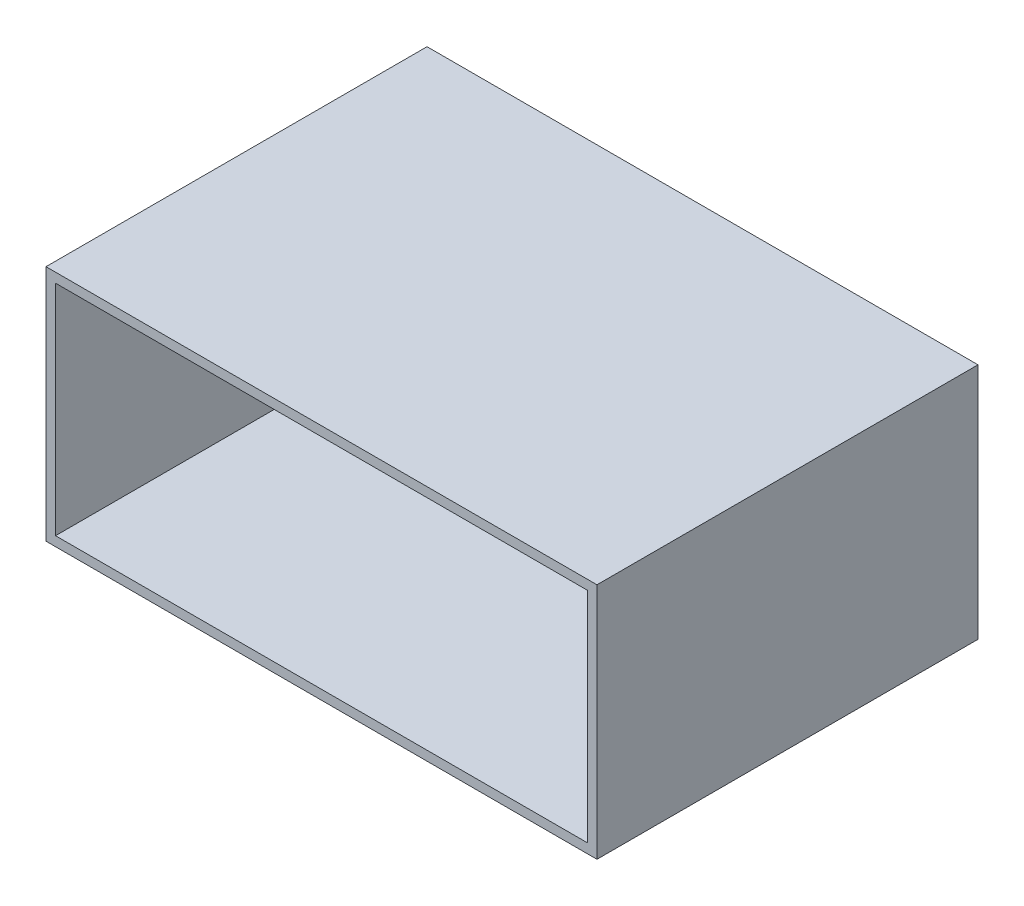
ISO-10303-21;
HEADER;
FILE_DESCRIPTION(('STEP AP214'),'2;1');
FILE_NAME('part.step','',(''),(''),'','','');
FILE_SCHEMA(('AUTOMOTIVE_DESIGN { 1 0 10303 214 1 1 1 1 }'));
ENDSEC;
DATA;
#1=APPLICATION_CONTEXT('core data for automotive mechanical design processes');
#2=APPLICATION_PROTOCOL_DEFINITION('international standard','automotive_design',2000,#1);
#3=PRODUCT_CONTEXT('',#1,'mechanical');
#4=PRODUCT('Part','Part','',(#3));
#5=PRODUCT_RELATED_PRODUCT_CATEGORY('part','',(#4));
#6=PRODUCT_DEFINITION_FORMATION('','',#4);
#7=PRODUCT_DEFINITION_CONTEXT('part definition',#1,'design');
#8=PRODUCT_DEFINITION('design','',#6,#7);
#9=PRODUCT_DEFINITION_SHAPE('','',#8);
#10=(LENGTH_UNIT() NAMED_UNIT(*) SI_UNIT(.MILLI.,.METRE.));
#11=(NAMED_UNIT(*) PLANE_ANGLE_UNIT() SI_UNIT($,.RADIAN.));
#12=(NAMED_UNIT(*) SI_UNIT($,.STERADIAN.) SOLID_ANGLE_UNIT());
#13=UNCERTAINTY_MEASURE_WITH_UNIT(LENGTH_MEASURE(1.E-05),#10,'distance_accuracy_value','');
#14=(GEOMETRIC_REPRESENTATION_CONTEXT(3) GLOBAL_UNCERTAINTY_ASSIGNED_CONTEXT((#13)) GLOBAL_UNIT_ASSIGNED_CONTEXT((#10,
#11,#12)) REPRESENTATION_CONTEXT('',''));
#15=CARTESIAN_POINT('',(0.,0.,0.));
#16=DIRECTION('',(0.,0.,1.));
#17=DIRECTION('',(1.,0.,0.));
#18=AXIS2_PLACEMENT_3D('',#15,#16,#17);
#19=CARTESIAN_POINT('',(0.,0.,127.));
#20=DIRECTION('',(0.,0.,1.));
#21=DIRECTION('',(1.,0.,0.));
#22=AXIS2_PLACEMENT_3D('',#19,#20,#21);
#23=PLANE('',#22);
#24=DIRECTION('',(0.,-1.,0.));
#25=VECTOR('',#24,1.);
#26=CARTESIAN_POINT('',(-3.175,0.,127.));
#27=LINE('',#26,#25);
#28=CARTESIAN_POINT('',(-3.175,76.073,127.));
#29=VERTEX_POINT('',#28);
#30=CARTESIAN_POINT('',(-3.175,-3.175,127.));
#31=VERTEX_POINT('',#30);
#32=EDGE_CURVE('E157',#29,#31,#27,.T.);
#33=ORIENTED_EDGE('',*,*,#32,.T.);
#34=DIRECTION('',(1.,0.,0.));
#35=VECTOR('',#34,1.);
#36=CARTESIAN_POINT('',(0.,-3.175,127.));
#37=LINE('',#36,#35);
#38=CARTESIAN_POINT('',(180.467,-3.175,127.));
#39=VERTEX_POINT('',#38);
#40=EDGE_CURVE('E160',#31,#39,#37,.T.);
#41=ORIENTED_EDGE('',*,*,#40,.T.);
#42=DIRECTION('',(0.,1.,0.));
#43=VECTOR('',#42,1.);
#44=CARTESIAN_POINT('',(180.467,0.,127.));
#45=LINE('',#44,#43);
#46=CARTESIAN_POINT('',(180.467,76.073,127.));
#47=VERTEX_POINT('',#46);
#48=EDGE_CURVE('E163',#39,#47,#45,.T.);
#49=ORIENTED_EDGE('',*,*,#48,.T.);
#50=DIRECTION('',(-1.,0.,0.));
#51=VECTOR('',#50,1.);
#52=CARTESIAN_POINT('',(0.,76.073,127.));
#53=LINE('',#52,#51);
#54=EDGE_CURVE('E165',#47,#29,#53,.T.);
#55=ORIENTED_EDGE('',*,*,#54,.T.);
#56=EDGE_LOOP('',(#33,#41,#49,#55));
#57=FACE_BOUND('',#56,.T.);
#58=DIRECTION('',(1.,0.,0.));
#59=VECTOR('',#58,1.);
#60=CARTESIAN_POINT('',(0.,0.,127.));
#61=LINE('',#60,#59);
#62=CARTESIAN_POINT('',(0.,0.,127.));
#63=VERTEX_POINT('',#62);
#64=CARTESIAN_POINT('',(177.292,0.,127.));
#65=VERTEX_POINT('',#64);
#66=EDGE_CURVE('E129',#63,#65,#61,.T.);
#67=ORIENTED_EDGE('',*,*,#66,.F.);
#68=DIRECTION('',(0.,-1.,0.));
#69=VECTOR('',#68,1.);
#70=CARTESIAN_POINT('',(0.,0.,127.));
#71=LINE('',#70,#69);
#72=CARTESIAN_POINT('',(0.,72.898,127.));
#73=VERTEX_POINT('',#72);
#74=EDGE_CURVE('E121',#73,#63,#71,.T.);
#75=ORIENTED_EDGE('',*,*,#74,.F.);
#76=DIRECTION('',(-1.,0.,0.));
#77=VECTOR('',#76,1.);
#78=CARTESIAN_POINT('',(0.,72.898,127.));
#79=LINE('',#78,#77);
#80=CARTESIAN_POINT('',(177.292,72.898,127.));
#81=VERTEX_POINT('',#80);
#82=EDGE_CURVE('E143',#81,#73,#79,.T.);
#83=ORIENTED_EDGE('',*,*,#82,.F.);
#84=DIRECTION('',(0.,1.,0.));
#85=VECTOR('',#84,1.);
#86=CARTESIAN_POINT('',(177.292,0.,127.));
#87=LINE('',#86,#85);
#88=EDGE_CURVE('E141',#65,#81,#87,.T.);
#89=ORIENTED_EDGE('',*,*,#88,.F.);
#90=EDGE_LOOP('',(#67,#75,#83,#89));
#91=FACE_BOUND('',#90,.T.);
#92=ADVANCED_FACE('F56',(#57,#91),#23,.T.);
#93=CARTESIAN_POINT('',(0.,0.,0.));
#94=DIRECTION('',(0.,0.,1.));
#95=DIRECTION('',(1.,0.,0.));
#96=AXIS2_PLACEMENT_3D('',#93,#94,#95);
#97=PLANE('',#96);
#98=DIRECTION('',(0.,-1.,0.));
#99=VECTOR('',#98,1.);
#100=CARTESIAN_POINT('',(-3.175,0.,0.));
#101=LINE('',#100,#99);
#102=CARTESIAN_POINT('',(-3.175,76.073,0.));
#103=VERTEX_POINT('',#102);
#104=CARTESIAN_POINT('',(-3.175,-3.175,0.));
#105=VERTEX_POINT('',#104);
#106=EDGE_CURVE('E137',#103,#105,#101,.T.);
#107=ORIENTED_EDGE('',*,*,#106,.F.);
#108=DIRECTION('',(-1.,0.,0.));
#109=VECTOR('',#108,1.);
#110=CARTESIAN_POINT('',(0.,76.073,0.));
#111=LINE('',#110,#109);
#112=CARTESIAN_POINT('',(180.467,76.073,0.));
#113=VERTEX_POINT('',#112);
#114=EDGE_CURVE('E161',#113,#103,#111,.T.);
#115=ORIENTED_EDGE('',*,*,#114,.F.);
#116=DIRECTION('',(0.,1.,0.));
#117=VECTOR('',#116,1.);
#118=CARTESIAN_POINT('',(180.467,0.,0.));
#119=LINE('',#118,#117);
#120=CARTESIAN_POINT('',(180.467,-3.175,0.));
#121=VERTEX_POINT('',#120);
#122=EDGE_CURVE('E172',#121,#113,#119,.T.);
#123=ORIENTED_EDGE('',*,*,#122,.F.);
#124=DIRECTION('',(1.,0.,0.));
#125=VECTOR('',#124,1.);
#126=CARTESIAN_POINT('',(0.,-3.175,0.));
#127=LINE('',#126,#125);
#128=EDGE_CURVE('E170',#105,#121,#127,.T.);
#129=ORIENTED_EDGE('',*,*,#128,.F.);
#130=EDGE_LOOP('',(#107,#115,#123,#129));
#131=FACE_BOUND('',#130,.T.);
#132=DIRECTION('',(0.,-1.,0.));
#133=VECTOR('',#132,1.);
#134=CARTESIAN_POINT('',(0.,0.,0.));
#135=LINE('',#134,#133);
#136=CARTESIAN_POINT('',(0.,72.898,0.));
#137=VERTEX_POINT('',#136);
#138=CARTESIAN_POINT('',(0.,0.,0.));
#139=VERTEX_POINT('',#138);
#140=EDGE_CURVE('E79',#137,#139,#135,.T.);
#141=ORIENTED_EDGE('',*,*,#140,.T.);
#142=DIRECTION('',(1.,0.,0.));
#143=VECTOR('',#142,1.);
#144=CARTESIAN_POINT('',(0.,0.,0.));
#145=LINE('',#144,#143);
#146=CARTESIAN_POINT('',(177.292,0.,0.));
#147=VERTEX_POINT('',#146);
#148=EDGE_CURVE('E136',#139,#147,#145,.T.);
#149=ORIENTED_EDGE('',*,*,#148,.T.);
#150=DIRECTION('',(0.,1.,0.));
#151=VECTOR('',#150,1.);
#152=CARTESIAN_POINT('',(177.292,0.,0.));
#153=LINE('',#152,#151);
#154=CARTESIAN_POINT('',(177.292,72.898,0.));
#155=VERTEX_POINT('',#154);
#156=EDGE_CURVE('E149',#147,#155,#153,.T.);
#157=ORIENTED_EDGE('',*,*,#156,.T.);
#158=DIRECTION('',(-1.,0.,0.));
#159=VECTOR('',#158,1.);
#160=CARTESIAN_POINT('',(0.,72.898,0.));
#161=LINE('',#160,#159);
#162=EDGE_CURVE('E130',#155,#137,#161,.T.);
#163=ORIENTED_EDGE('',*,*,#162,.T.);
#164=EDGE_LOOP('',(#141,#149,#157,#163));
#165=FACE_BOUND('',#164,.T.);
#166=ADVANCED_FACE('F190',(#131,#165),#97,.F.);
#167=CARTESIAN_POINT('',(-3.175,0.,127.));
#168=DIRECTION('',(1.,0.,0.));
#169=DIRECTION('',(0.,0.,-1.));
#170=AXIS2_PLACEMENT_3D('',#167,#168,#169);
#171=PLANE('',#170);
#172=ORIENTED_EDGE('',*,*,#106,.T.);
#173=DIRECTION('',(0.,0.,-1.));
#174=VECTOR('',#173,1.);
#175=CARTESIAN_POINT('',(-3.175,-3.175,127.));
#176=LINE('',#175,#174);
#177=EDGE_CURVE('E12',#31,#105,#176,.T.);
#178=ORIENTED_EDGE('',*,*,#177,.F.);
#179=ORIENTED_EDGE('',*,*,#32,.F.);
#180=DIRECTION('',(0.,0.,-1.));
#181=VECTOR('',#180,1.);
#182=CARTESIAN_POINT('',(-3.175,76.073,127.));
#183=LINE('',#182,#181);
#184=EDGE_CURVE('E167',#29,#103,#183,.T.);
#185=ORIENTED_EDGE('',*,*,#184,.T.);
#186=EDGE_LOOP('',(#172,#178,#179,#185));
#187=FACE_BOUND('',#186,.T.);
#188=ADVANCED_FACE('F58',(#187),#171,.F.);
#189=CARTESIAN_POINT('',(0.,-3.175,127.));
#190=DIRECTION('',(0.,1.,0.));
#191=DIRECTION('',(0.,0.,1.));
#192=AXIS2_PLACEMENT_3D('',#189,#190,#191);
#193=PLANE('',#192);
#194=ORIENTED_EDGE('',*,*,#128,.T.);
#195=DIRECTION('',(0.,0.,-1.));
#196=VECTOR('',#195,1.);
#197=CARTESIAN_POINT('',(180.467,-3.175,127.));
#198=LINE('',#197,#196);
#199=EDGE_CURVE('E64',#39,#121,#198,.T.);
#200=ORIENTED_EDGE('',*,*,#199,.F.);
#201=ORIENTED_EDGE('',*,*,#40,.F.);
#202=ORIENTED_EDGE('',*,*,#177,.T.);
#203=EDGE_LOOP('',(#194,#200,#201,#202));
#204=FACE_BOUND('',#203,.T.);
#205=ADVANCED_FACE('F200',(#204),#193,.F.);
#206=CARTESIAN_POINT('',(180.467,0.,127.));
#207=DIRECTION('',(-1.,0.,0.));
#208=DIRECTION('',(0.,0.,1.));
#209=AXIS2_PLACEMENT_3D('',#206,#207,#208);
#210=PLANE('',#209);
#211=ORIENTED_EDGE('',*,*,#122,.T.);
#212=DIRECTION('',(0.,0.,-1.));
#213=VECTOR('',#212,1.);
#214=CARTESIAN_POINT('',(180.467,76.073,127.));
#215=LINE('',#214,#213);
#216=EDGE_CURVE('E177',#47,#113,#215,.T.);
#217=ORIENTED_EDGE('',*,*,#216,.F.);
#218=ORIENTED_EDGE('',*,*,#48,.F.);
#219=ORIENTED_EDGE('',*,*,#199,.T.);
#220=EDGE_LOOP('',(#211,#217,#218,#219));
#221=FACE_BOUND('',#220,.T.);
#222=ADVANCED_FACE('F184',(#221),#210,.F.);
#223=CARTESIAN_POINT('',(0.,76.073,127.));
#224=DIRECTION('',(0.,-1.,0.));
#225=DIRECTION('',(0.,0.,-1.));
#226=AXIS2_PLACEMENT_3D('',#223,#224,#225);
#227=PLANE('',#226);
#228=ORIENTED_EDGE('',*,*,#114,.T.);
#229=ORIENTED_EDGE('',*,*,#184,.F.);
#230=ORIENTED_EDGE('',*,*,#54,.F.);
#231=ORIENTED_EDGE('',*,*,#216,.T.);
#232=EDGE_LOOP('',(#228,#229,#230,#231));
#233=FACE_BOUND('',#232,.T.);
#234=ADVANCED_FACE('F194',(#233),#227,.F.);
#235=CARTESIAN_POINT('',(0.,0.,127.));
#236=DIRECTION('',(1.,0.,0.));
#237=DIRECTION('',(0.,0.,-1.));
#238=AXIS2_PLACEMENT_3D('',#235,#236,#237);
#239=PLANE('',#238);
#240=ORIENTED_EDGE('',*,*,#140,.F.);
#241=DIRECTION('',(0.,0.,-1.));
#242=VECTOR('',#241,1.);
#243=CARTESIAN_POINT('',(0.,72.898,127.));
#244=LINE('',#243,#242);
#245=EDGE_CURVE('E125',#73,#137,#244,.T.);
#246=ORIENTED_EDGE('',*,*,#245,.F.);
#247=ORIENTED_EDGE('',*,*,#74,.T.);
#248=DIRECTION('',(0.,0.,-1.));
#249=VECTOR('',#248,1.);
#250=CARTESIAN_POINT('',(0.,0.,127.));
#251=LINE('',#250,#249);
#252=EDGE_CURVE('E124',#63,#139,#251,.T.);
#253=ORIENTED_EDGE('',*,*,#252,.T.);
#254=EDGE_LOOP('',(#240,#246,#247,#253));
#255=FACE_BOUND('',#254,.T.);
#256=ADVANCED_FACE('F123',(#255),#239,.T.);
#257=CARTESIAN_POINT('',(0.,0.,127.));
#258=DIRECTION('',(0.,1.,0.));
#259=DIRECTION('',(0.,0.,1.));
#260=AXIS2_PLACEMENT_3D('',#257,#258,#259);
#261=PLANE('',#260);
#262=ORIENTED_EDGE('',*,*,#148,.F.);
#263=ORIENTED_EDGE('',*,*,#252,.F.);
#264=ORIENTED_EDGE('',*,*,#66,.T.);
#265=DIRECTION('',(0.,0.,-1.));
#266=VECTOR('',#265,1.);
#267=CARTESIAN_POINT('',(177.292,0.,127.));
#268=LINE('',#267,#266);
#269=EDGE_CURVE('E138',#65,#147,#268,.T.);
#270=ORIENTED_EDGE('',*,*,#269,.T.);
#271=EDGE_LOOP('',(#262,#263,#264,#270));
#272=FACE_BOUND('',#271,.T.);
#273=ADVANCED_FACE('F133',(#272),#261,.T.);
#274=CARTESIAN_POINT('',(177.292,0.,127.));
#275=DIRECTION('',(-1.,0.,0.));
#276=DIRECTION('',(0.,0.,1.));
#277=AXIS2_PLACEMENT_3D('',#274,#275,#276);
#278=PLANE('',#277);
#279=ORIENTED_EDGE('',*,*,#156,.F.);
#280=ORIENTED_EDGE('',*,*,#269,.F.);
#281=ORIENTED_EDGE('',*,*,#88,.T.);
#282=DIRECTION('',(0.,0.,-1.));
#283=VECTOR('',#282,1.);
#284=CARTESIAN_POINT('',(177.292,72.898,127.));
#285=LINE('',#284,#283);
#286=EDGE_CURVE('E71',#81,#155,#285,.T.);
#287=ORIENTED_EDGE('',*,*,#286,.T.);
#288=EDGE_LOOP('',(#279,#280,#281,#287));
#289=FACE_BOUND('',#288,.T.);
#290=ADVANCED_FACE('F223',(#289),#278,.T.);
#291=CARTESIAN_POINT('',(0.,72.898,127.));
#292=DIRECTION('',(0.,-1.,0.));
#293=DIRECTION('',(0.,0.,-1.));
#294=AXIS2_PLACEMENT_3D('',#291,#292,#293);
#295=PLANE('',#294);
#296=ORIENTED_EDGE('',*,*,#162,.F.);
#297=ORIENTED_EDGE('',*,*,#286,.F.);
#298=ORIENTED_EDGE('',*,*,#82,.T.);
#299=ORIENTED_EDGE('',*,*,#245,.T.);
#300=EDGE_LOOP('',(#296,#297,#298,#299));
#301=FACE_BOUND('',#300,.T.);
#302=ADVANCED_FACE('F227',(#301),#295,.T.);
#303=CLOSED_SHELL('',(#92,#166,#188,#205,#222,#234,#256,#273,#290,#302));
#304=MANIFOLD_SOLID_BREP('B2',#303);
#305=ADVANCED_BREP_SHAPE_REPRESENTATION('',(#18,#304),#14);
#306=SHAPE_DEFINITION_REPRESENTATION(#9,#305);
ENDSEC;
END-ISO-10303-21;
